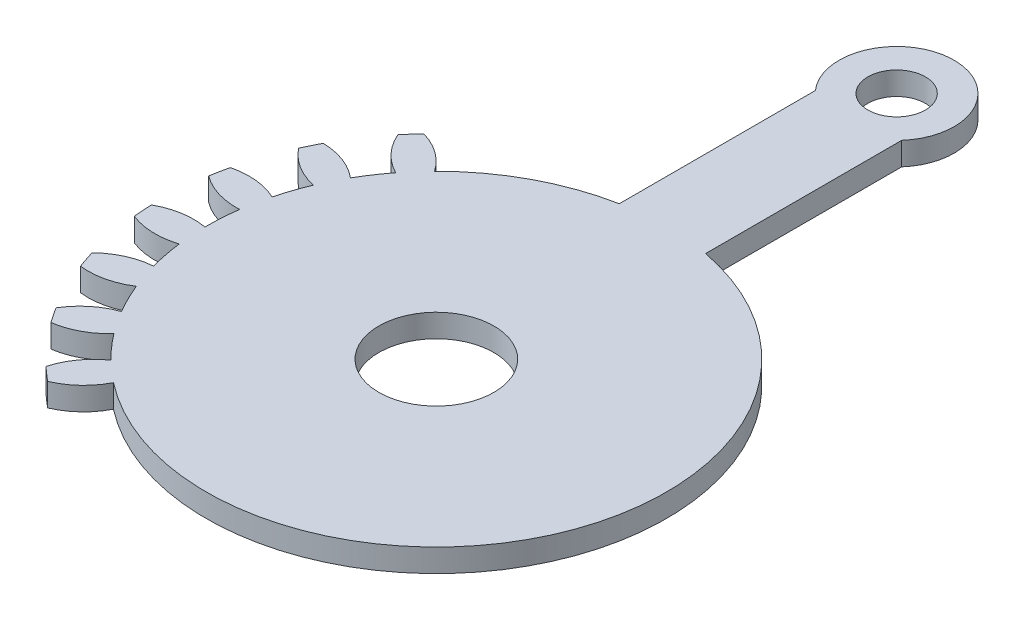
ISO-10303-21;
HEADER;
FILE_DESCRIPTION(('STEP AP214'),'2;1');
FILE_NAME('part.step','',(''),(''),'','','');
FILE_SCHEMA(('AUTOMOTIVE_DESIGN { 1 0 10303 214 1 1 1 1 }'));
ENDSEC;
DATA;
#1=APPLICATION_CONTEXT('core data for automotive mechanical design processes');
#2=APPLICATION_PROTOCOL_DEFINITION('international standard','automotive_design',2000,#1);
#3=PRODUCT_CONTEXT('',#1,'mechanical');
#4=PRODUCT('Part','Part','',(#3));
#5=PRODUCT_RELATED_PRODUCT_CATEGORY('part','',(#4));
#6=PRODUCT_DEFINITION_FORMATION('','',#4);
#7=PRODUCT_DEFINITION_CONTEXT('part definition',#1,'design');
#8=PRODUCT_DEFINITION('design','',#6,#7);
#9=PRODUCT_DEFINITION_SHAPE('','',#8);
#10=(LENGTH_UNIT() NAMED_UNIT(*) SI_UNIT(.MILLI.,.METRE.));
#11=(NAMED_UNIT(*) PLANE_ANGLE_UNIT() SI_UNIT($,.RADIAN.));
#12=(NAMED_UNIT(*) SI_UNIT($,.STERADIAN.) SOLID_ANGLE_UNIT());
#13=UNCERTAINTY_MEASURE_WITH_UNIT(LENGTH_MEASURE(1.E-05),#10,'distance_accuracy_value','');
#14=(GEOMETRIC_REPRESENTATION_CONTEXT(3) GLOBAL_UNCERTAINTY_ASSIGNED_CONTEXT((#13)) GLOBAL_UNIT_ASSIGNED_CONTEXT((#10,
#11,#12)) REPRESENTATION_CONTEXT('',''));
#15=CARTESIAN_POINT('',(0.,0.,0.));
#16=DIRECTION('',(0.,0.,1.));
#17=DIRECTION('',(1.,0.,0.));
#18=AXIS2_PLACEMENT_3D('',#15,#16,#17);
#19=CARTESIAN_POINT('',(0.,2.54,0.));
#20=DIRECTION('',(0.,-1.,0.));
#21=DIRECTION('',(0.,0.,-1.));
#22=AXIS2_PLACEMENT_3D('',#19,#20,#21);
#23=CYLINDRICAL_SURFACE('',#22,25.4);
#24=CARTESIAN_POINT('',(0.,2.54,0.));
#25=DIRECTION('',(0.,1.,0.));
#26=DIRECTION('',(0.,0.,1.));
#27=AXIS2_PLACEMENT_3D('',#24,#25,#26);
#28=CIRCLE('',#27,25.4);
#29=CARTESIAN_POINT('',(-4.7625,2.54,-24.949520912234));
#30=VERTEX_POINT('',#29);
#31=CARTESIAN_POINT('',(-18.0579662529017,2.54,-17.8625265516685));
#32=VERTEX_POINT('',#31);
#33=EDGE_CURVE('E56',#30,#32,#28,.T.);
#34=ORIENTED_EDGE('',*,*,#33,.F.);
#35=DIRECTION('',(0.,-1.,0.));
#36=VECTOR('',#35,1.);
#37=CARTESIAN_POINT('',(-4.7625,2.54,-24.949520912234));
#38=LINE('',#37,#36);
#39=CARTESIAN_POINT('',(-4.7625,0.,-24.949520912234));
#40=VERTEX_POINT('',#39);
#41=EDGE_CURVE('E274',#30,#40,#38,.T.);
#42=ORIENTED_EDGE('',*,*,#41,.T.);
#43=CARTESIAN_POINT('',(0.,0.,0.));
#44=DIRECTION('',(0.,1.,0.));
#45=DIRECTION('',(0.,0.,1.));
#46=AXIS2_PLACEMENT_3D('',#43,#44,#45);
#47=CIRCLE('',#46,25.4);
#48=CARTESIAN_POINT('',(-18.0579662529017,0.,-17.8625265516685));
#49=VERTEX_POINT('',#48);
#50=EDGE_CURVE('E630',#40,#49,#47,.T.);
#51=ORIENTED_EDGE('',*,*,#50,.T.);
#52=DIRECTION('',(0.,-1.,0.));
#53=VECTOR('',#52,1.);
#54=CARTESIAN_POINT('',(-18.0579662529017,2.54,-17.8625265516685));
#55=LINE('',#54,#53);
#56=EDGE_CURVE('E331',#32,#49,#55,.T.);
#57=ORIENTED_EDGE('',*,*,#56,.F.);
#58=EDGE_LOOP('',(#34,#42,#51,#57));
#59=FACE_BOUND('',#58,.T.);
#60=ADVANCED_FACE('F45',(#59),#23,.T.);
#61=DIRECTION('',(0.,-1.,0.));
#62=VECTOR('',#61,1.);
#63=CARTESIAN_POINT('',(-20.0667477350344,2.54,-15.5719502740823));
#64=LINE('',#63,#62);
#65=CARTESIAN_POINT('',(-20.0667477350344,2.54,-15.5719502740823));
#66=VERTEX_POINT('',#65);
#67=CARTESIAN_POINT('',(-20.0667477350344,0.,-15.5719502740823));
#68=VERTEX_POINT('',#67);
#69=EDGE_CURVE('E335',#66,#68,#64,.T.);
#70=ORIENTED_EDGE('',*,*,#69,.T.);
#71=CARTESIAN_POINT('',(-22.0658180391555,0.,-12.5801301369613));
#72=VERTEX_POINT('',#71);
#73=EDGE_CURVE('E619',#68,#72,#47,.T.);
#74=ORIENTED_EDGE('',*,*,#73,.T.);
#75=DIRECTION('',(0.,-1.,0.));
#76=VECTOR('',#75,1.);
#77=CARTESIAN_POINT('',(-22.0658180391555,2.54,-12.5801301369613));
#78=LINE('',#77,#76);
#79=CARTESIAN_POINT('',(-22.0658180391555,2.54,-12.5801301369613));
#80=VERTEX_POINT('',#79);
#81=EDGE_CURVE('E370',#80,#72,#78,.T.);
#82=ORIENTED_EDGE('',*,*,#81,.F.);
#83=EDGE_CURVE('E620',#66,#80,#28,.T.);
#84=ORIENTED_EDGE('',*,*,#83,.F.);
#85=EDGE_LOOP('',(#70,#74,#82,#84));
#86=FACE_BOUND('',#85,.T.);
#87=ADVANCED_FACE('F606',(#86),#23,.T.);
#88=DIRECTION('',(0.,-1.,0.));
#89=VECTOR('',#88,1.);
#90=CARTESIAN_POINT('',(-23.4133071872193,2.54,-9.84769244833043));
#91=LINE('',#90,#89);
#92=CARTESIAN_POINT('',(-23.4133071872193,2.54,-9.84769244833043));
#93=VERTEX_POINT('',#92);
#94=CARTESIAN_POINT('',(-23.4133071872193,0.,-9.84769244833043));
#95=VERTEX_POINT('',#94);
#96=EDGE_CURVE('E374',#93,#95,#91,.T.);
#97=ORIENTED_EDGE('',*,*,#96,.T.);
#98=CARTESIAN_POINT('',(-24.5699207915292,0.,-6.4404186430681));
#99=VERTEX_POINT('',#98);
#100=EDGE_CURVE('E582',#95,#99,#47,.T.);
#101=ORIENTED_EDGE('',*,*,#100,.T.);
#102=DIRECTION('',(0.,-1.,0.));
#103=VECTOR('',#102,1.);
#104=CARTESIAN_POINT('',(-24.5699207915292,2.54,-6.4404186430681));
#105=LINE('',#104,#103);
#106=CARTESIAN_POINT('',(-24.5699207915292,2.54,-6.4404186430681));
#107=VERTEX_POINT('',#106);
#108=EDGE_CURVE('E565',#107,#99,#105,.T.);
#109=ORIENTED_EDGE('',*,*,#108,.F.);
#110=EDGE_CURVE('E646',#93,#107,#28,.T.);
#111=ORIENTED_EDGE('',*,*,#110,.F.);
#112=EDGE_LOOP('',(#97,#101,#109,#111));
#113=FACE_BOUND('',#112,.T.);
#114=ADVANCED_FACE('F610',(#113),#23,.T.);
#115=CARTESIAN_POINT('',(-15.5719502740822,0.,20.0667477350345));
#116=VERTEX_POINT('',#115);
#117=CARTESIAN_POINT('',(4.7625,0.,-24.949520912234));
#118=VERTEX_POINT('',#117);
#119=EDGE_CURVE('E633',#116,#118,#47,.T.);
#120=ORIENTED_EDGE('',*,*,#119,.T.);
#121=DIRECTION('',(0.,-1.,0.));
#122=VECTOR('',#121,1.);
#123=CARTESIAN_POINT('',(4.7625,2.54,-24.949520912234));
#124=LINE('',#123,#122);
#125=CARTESIAN_POINT('',(4.7625,2.54,-24.949520912234));
#126=VERTEX_POINT('',#125);
#127=EDGE_CURVE('E70',#118,#126,#124,.F.);
#128=ORIENTED_EDGE('',*,*,#127,.T.);
#129=CARTESIAN_POINT('',(-15.5719502740822,2.54,20.0667477350345));
#130=VERTEX_POINT('',#129);
#131=EDGE_CURVE('E648',#130,#126,#28,.T.);
#132=ORIENTED_EDGE('',*,*,#131,.F.);
#133=DIRECTION('',(0.,-1.,0.));
#134=VECTOR('',#133,1.);
#135=CARTESIAN_POINT('',(-15.5719502740822,2.54,20.0667477350345));
#136=LINE('',#135,#134);
#137=EDGE_CURVE('E413',#130,#116,#136,.T.);
#138=ORIENTED_EDGE('',*,*,#137,.T.);
#139=EDGE_LOOP('',(#120,#128,#132,#138));
#140=FACE_BOUND('',#139,.T.);
#141=ADVANCED_FACE('F615',(#140),#23,.T.);
#142=CARTESIAN_POINT('',(-20.23500542252,0.,15.3526725865755));
#143=VERTEX_POINT('',#142);
#144=CARTESIAN_POINT('',(-17.8625265516685,0.,18.0579662529018));
#145=VERTEX_POINT('',#144);
#146=EDGE_CURVE('E636',#143,#145,#47,.T.);
#147=ORIENTED_EDGE('',*,*,#146,.T.);
#148=DIRECTION('',(0.,-1.,0.));
#149=VECTOR('',#148,1.);
#150=CARTESIAN_POINT('',(-17.8625265516685,2.54,18.0579662529018));
#151=LINE('',#150,#149);
#152=CARTESIAN_POINT('',(-17.8625265516685,2.54,18.0579662529018));
#153=VERTEX_POINT('',#152);
#154=EDGE_CURVE('E409',#153,#145,#151,.T.);
#155=ORIENTED_EDGE('',*,*,#154,.F.);
#156=CARTESIAN_POINT('',(-20.2350054225199,2.54,15.3526725865755));
#157=VERTEX_POINT('',#156);
#158=EDGE_CURVE('E652',#157,#153,#28,.T.);
#159=ORIENTED_EDGE('',*,*,#158,.F.);
#160=DIRECTION('',(0.,-1.,0.));
#161=VECTOR('',#160,1.);
#162=CARTESIAN_POINT('',(-20.23500542252,2.54,15.3526725865755));
#163=LINE('',#162,#161);
#164=EDGE_CURVE('E452',#157,#143,#163,.T.);
#165=ORIENTED_EDGE('',*,*,#164,.T.);
#166=EDGE_LOOP('',(#147,#155,#159,#165));
#167=FACE_BOUND('',#166,.T.);
#168=ADVANCED_FACE('F714',(#167),#23,.T.);
#169=CARTESIAN_POINT('',(-23.5190783913405,0.,9.59233817283255));
#170=VERTEX_POINT('',#169);
#171=CARTESIAN_POINT('',(-21.9276213011004,0.,12.819493908713));
#172=VERTEX_POINT('',#171);
#173=EDGE_CURVE('E638',#170,#172,#47,.T.);
#174=ORIENTED_EDGE('',*,*,#173,.T.);
#175=DIRECTION('',(0.,-1.,0.));
#176=VECTOR('',#175,1.);
#177=CARTESIAN_POINT('',(-21.9276213011004,2.54,12.819493908713));
#178=LINE('',#177,#176);
#179=CARTESIAN_POINT('',(-21.9276213011004,2.54,12.819493908713));
#180=VERTEX_POINT('',#179);
#181=EDGE_CURVE('E448',#180,#172,#178,.T.);
#182=ORIENTED_EDGE('',*,*,#181,.F.);
#183=CARTESIAN_POINT('',(-23.5190783913405,2.54,9.59233817283255));
#184=VERTEX_POINT('',#183);
#185=EDGE_CURVE('E656',#184,#180,#28,.T.);
#186=ORIENTED_EDGE('',*,*,#185,.F.);
#187=DIRECTION('',(0.,-1.,0.));
#188=VECTOR('',#187,1.);
#189=CARTESIAN_POINT('',(-23.5190783913405,2.54,9.59233817283255));
#190=LINE('',#189,#188);
#191=EDGE_CURVE('E491',#184,#170,#190,.T.);
#192=ORIENTED_EDGE('',*,*,#191,.T.);
#193=EDGE_LOOP('',(#174,#182,#186,#192));
#194=FACE_BOUND('',#193,.T.);
#195=ADVANCED_FACE('F730',(#194),#23,.T.);
#196=CARTESIAN_POINT('',(-25.2003650349059,0.,3.17830176469937));
#197=VERTEX_POINT('',#196);
#198=CARTESIAN_POINT('',(-24.4983848959698,0.,6.70739423986077));
#199=VERTEX_POINT('',#198);
#200=EDGE_CURVE('E641',#197,#199,#47,.T.);
#201=ORIENTED_EDGE('',*,*,#200,.T.);
#202=DIRECTION('',(0.,-1.,0.));
#203=VECTOR('',#202,1.);
#204=CARTESIAN_POINT('',(-24.4983848959698,2.54,6.70739423986077));
#205=LINE('',#204,#203);
#206=CARTESIAN_POINT('',(-24.4983848959698,2.54,6.70739423986077));
#207=VERTEX_POINT('',#206);
#208=EDGE_CURVE('E487',#207,#199,#205,.T.);
#209=ORIENTED_EDGE('',*,*,#208,.F.);
#210=CARTESIAN_POINT('',(-25.2003650349059,2.54,3.17830176469936));
#211=VERTEX_POINT('',#210);
#212=EDGE_CURVE('E55',#211,#207,#28,.T.);
#213=ORIENTED_EDGE('',*,*,#212,.F.);
#214=DIRECTION('',(0.,-1.,0.));
#215=VECTOR('',#214,1.);
#216=CARTESIAN_POINT('',(-25.2003650349059,2.54,3.17830176469937));
#217=LINE('',#216,#215);
#218=EDGE_CURVE('E530',#211,#197,#217,.T.);
#219=ORIENTED_EDGE('',*,*,#218,.T.);
#220=EDGE_LOOP('',(#201,#209,#213,#219));
#221=FACE_BOUND('',#220,.T.);
#222=ADVANCED_FACE('F603',(#221),#23,.T.);
#223=CARTESIAN_POINT('',(-25.1642884469148,0.,-3.45233065630608));
#224=VERTEX_POINT('',#223);
#225=CARTESIAN_POINT('',(-25.3996240456742,0.,0.138196738055112));
#226=VERTEX_POINT('',#225);
#227=EDGE_CURVE('E49',#224,#226,#47,.T.);
#228=ORIENTED_EDGE('',*,*,#227,.T.);
#229=DIRECTION('',(0.,-1.,0.));
#230=VECTOR('',#229,1.);
#231=CARTESIAN_POINT('',(-25.3996240456742,2.54,0.138196738055112));
#232=LINE('',#231,#230);
#233=CARTESIAN_POINT('',(-25.3996240456742,2.54,0.138196738055112));
#234=VERTEX_POINT('',#233);
#235=EDGE_CURVE('E526',#234,#226,#232,.T.);
#236=ORIENTED_EDGE('',*,*,#235,.F.);
#237=CARTESIAN_POINT('',(-25.1642884469148,2.54,-3.45233065630609));
#238=VERTEX_POINT('',#237);
#239=EDGE_CURVE('E11',#238,#234,#28,.T.);
#240=ORIENTED_EDGE('',*,*,#239,.F.);
#241=DIRECTION('',(0.,-1.,0.));
#242=VECTOR('',#241,1.);
#243=CARTESIAN_POINT('',(-25.1642884469148,2.54,-3.45233065630608));
#244=LINE('',#243,#242);
#245=EDGE_CURVE('E569',#238,#224,#244,.T.);
#246=ORIENTED_EDGE('',*,*,#245,.T.);
#247=EDGE_LOOP('',(#228,#236,#240,#246));
#248=FACE_BOUND('',#247,.T.);
#249=ADVANCED_FACE('F47',(#248),#23,.T.);
#250=CARTESIAN_POINT('',(0.,2.54,0.));
#251=DIRECTION('',(0.,1.,0.));
#252=DIRECTION('',(0.,0.,1.));
#253=AXIS2_PLACEMENT_3D('',#250,#251,#252);
#254=PLANE('',#253);
#255=CARTESIAN_POINT('',(0.,2.54,0.));
#256=DIRECTION('',(0.,1.,0.));
#257=DIRECTION('',(0.,0.,1.));
#258=AXIS2_PLACEMENT_3D('',#255,#256,#257);
#259=CIRCLE('',#258,6.35);
#260=CARTESIAN_POINT('',(0.,2.54,6.35));
#261=VERTEX_POINT('',#260);
#262=EDGE_CURVE('E578',#261,#261,#259,.T.);
#263=ORIENTED_EDGE('',*,*,#262,.F.);
#264=EDGE_LOOP('',(#263));
#265=FACE_BOUND('',#264,.T.);
#266=ORIENTED_EDGE('',*,*,#131,.T.);
#267=DIRECTION('',(0.,0.,-1.));
#268=VECTOR('',#267,1.);
#269=CARTESIAN_POINT('',(4.7625,2.54,-46.599869793685));
#270=LINE('',#269,#268);
#271=CARTESIAN_POINT('',(4.7625,2.54,-46.599869793685));
#272=VERTEX_POINT('',#271);
#273=EDGE_CURVE('E269',#126,#272,#270,.T.);
#274=ORIENTED_EDGE('',*,*,#273,.T.);
#275=CARTESIAN_POINT('',(0.,2.54,-50.8));
#276=DIRECTION('',(0.,1.,0.));
#277=DIRECTION('',(0.,0.,1.));
#278=AXIS2_PLACEMENT_3D('',#275,#276,#277);
#279=CIRCLE('',#278,6.35);
#280=CARTESIAN_POINT('',(-4.7625,2.54,-46.599869793685));
#281=VERTEX_POINT('',#280);
#282=EDGE_CURVE('E263',#272,#281,#279,.T.);
#283=ORIENTED_EDGE('',*,*,#282,.T.);
#284=DIRECTION('',(0.,0.,1.));
#285=VECTOR('',#284,1.);
#286=CARTESIAN_POINT('',(-4.7625,2.54,-46.599869793685));
#287=LINE('',#286,#285);
#288=EDGE_CURVE('E272',#281,#30,#287,.T.);
#289=ORIENTED_EDGE('',*,*,#288,.T.);
#290=ORIENTED_EDGE('',*,*,#33,.T.);
#291=CARTESIAN_POINT('',(-24.3199642046817,2.54,-13.5206627062787));
#292=DIRECTION('',(0.,1.,0.));
#293=DIRECTION('',(-0.500000000000001,0.,0.866025403784438));
#294=AXIS2_PLACEMENT_3D('',#291,#292,#293);
#295=CIRCLE('',#294,7.62);
#296=CARTESIAN_POINT('',(-22.2335438772269,2.54,-20.8494586658605));
#297=VERTEX_POINT('',#296);
#298=EDGE_CURVE('E314',#297,#32,#295,.F.);
#299=ORIENTED_EDGE('',*,*,#298,.F.);
#300=CARTESIAN_POINT('',(0.,2.54,0.));
#301=DIRECTION('',(0.,1.,0.));
#302=DIRECTION('',(-0.500000000000001,0.,0.866025403784438));
#303=AXIS2_PLACEMENT_3D('',#300,#301,#302);
#304=CIRCLE('',#303,30.48);
#305=CARTESIAN_POINT('',(-23.5731484785449,2.54,-19.3219323777017));
#306=VERTEX_POINT('',#305);
#307=EDGE_CURVE('E305',#297,#306,#304,.T.);
#308=ORIENTED_EDGE('',*,*,#307,.T.);
#309=CARTESIAN_POINT('',(-16.5793838850735,2.54,-22.3471029201845));
#310=DIRECTION('',(0.,1.,0.));
#311=DIRECTION('',(-0.500000000000001,0.,0.866025403784438));
#312=AXIS2_PLACEMENT_3D('',#309,#310,#311);
#313=CIRCLE('',#312,7.62);
#314=EDGE_CURVE('E309',#306,#66,#313,.T.);
#315=ORIENTED_EDGE('',*,*,#314,.T.);
#316=ORIENTED_EDGE('',*,*,#83,.T.);
#317=CARTESIAN_POINT('',(-26.9906865305201,2.54,-6.76548738415482));
#318=DIRECTION('',(0.,1.,0.));
#319=DIRECTION('',(-0.258819045102521,0.,0.965925826289068));
#320=AXIS2_PLACEMENT_3D('',#317,#318,#319);
#321=CIRCLE('',#320,7.62);
#322=CARTESIAN_POINT('',(-26.8721912237471,2.54,-14.3845659939523));
#323=VERTEX_POINT('',#322);
#324=EDGE_CURVE('E353',#323,#80,#321,.F.);
#325=ORIENTED_EDGE('',*,*,#324,.F.);
#326=CARTESIAN_POINT('',(0.,2.54,0.));
#327=DIRECTION('',(0.,1.,0.));
#328=DIRECTION('',(-0.258819045102521,0.,0.965925826289068));
#329=AXIS2_PLACEMENT_3D('',#326,#327,#328);
#330=CIRCLE('',#329,30.48);
#331=CARTESIAN_POINT('',(-27.7707970099056,2.54,-12.562373718156));
#332=VERTEX_POINT('',#331);
#333=EDGE_CURVE('E344',#323,#332,#330,.T.);
#334=ORIENTED_EDGE('',*,*,#333,.T.);
#335=CARTESIAN_POINT('',(-21.7983109171632,2.54,-17.2945835478232));
#336=DIRECTION('',(0.,1.,0.));
#337=DIRECTION('',(-0.258819045102521,0.,0.965925826289068));
#338=AXIS2_PLACEMENT_3D('',#335,#336,#337);
#339=CIRCLE('',#338,7.62);
#340=EDGE_CURVE('E348',#332,#93,#339,.T.);
#341=ORIENTED_EDGE('',*,*,#340,.T.);
#342=ORIENTED_EDGE('',*,*,#110,.T.);
#343=CARTESIAN_POINT('',(-27.8220381735219,2.54,0.450744722702677));
#344=DIRECTION('',(0.,1.,0.));
#345=DIRECTION('',(0.,0.,1.));
#346=AXIS2_PLACEMENT_3D('',#343,#344,#345);
#347=CIRCLE('',#346,7.62);
#348=CARTESIAN_POINT('',(-29.6795431467647,2.54,-6.93938892117538));
#349=VERTEX_POINT('',#348);
#350=EDGE_CURVE('E548',#349,#107,#347,.F.);
#351=ORIENTED_EDGE('',*,*,#350,.F.);
#352=CARTESIAN_POINT('',(0.,2.54,0.));
#353=DIRECTION('',(0.,1.,0.));
#354=DIRECTION('',(0.,0.,1.));
#355=AXIS2_PLACEMENT_3D('',#352,#353,#354);
#356=CIRCLE('',#355,30.48);
#357=CARTESIAN_POINT('',(-30.0759116184532,2.54,-4.94671005002223));
#358=VERTEX_POINT('',#357);
#359=EDGE_CURVE('E539',#349,#358,#356,.T.);
#360=ORIENTED_EDGE('',*,*,#359,.T.);
#361=CARTESIAN_POINT('',(-25.5317190836603,2.54,-11.0634668873284));
#362=DIRECTION('',(0.,1.,0.));
#363=DIRECTION('',(0.,0.,1.));
#364=AXIS2_PLACEMENT_3D('',#361,#362,#363);
#365=CIRCLE('',#364,7.62);
#366=EDGE_CURVE('E543',#358,#238,#365,.T.);
#367=ORIENTED_EDGE('',*,*,#366,.T.);
#368=ORIENTED_EDGE('',*,*,#239,.T.);
#369=CARTESIAN_POINT('',(-26.7573638930902,2.54,7.63625932159886));
#370=DIRECTION('',(0.,1.,0.));
#371=DIRECTION('',(0.258819045102521,0.,0.965925826289068));
#372=AXIS2_PLACEMENT_3D('',#369,#370,#371);
#373=CIRCLE('',#372,7.62);
#374=CARTESIAN_POINT('',(-30.4642832520944,2.54,0.978696038697195));
#375=VERTEX_POINT('',#374);
#376=EDGE_CURVE('E509',#375,#234,#373,.F.);
#377=ORIENTED_EDGE('',*,*,#376,.F.);
#378=CARTESIAN_POINT('',(0.,2.54,0.));
#379=DIRECTION('',(0.,1.,0.));
#380=DIRECTION('',(0.258819045102521,0.,0.965925826289068));
#381=AXIS2_PLACEMENT_3D('',#378,#379,#380);
#382=CIRCLE('',#381,30.48);
#383=CARTESIAN_POINT('',(-30.3314025529972,2.54,3.00606373319573));
#384=VERTEX_POINT('',#383);
#385=EDGE_CURVE('E500',#375,#384,#382,.T.);
#386=ORIENTED_EDGE('',*,*,#385,.T.);
#387=CARTESIAN_POINT('',(-27.5251827877666,2.54,-4.07839324170567));
#388=DIRECTION('',(0.,1.,0.));
#389=DIRECTION('',(0.258819045102521,0.,0.965925826289068));
#390=AXIS2_PLACEMENT_3D('',#387,#388,#389);
#391=CIRCLE('',#390,7.62);
#392=EDGE_CURVE('E504',#384,#211,#391,.T.);
#393=ORIENTED_EDGE('',*,*,#392,.T.);
#394=ORIENTED_EDGE('',*,*,#212,.T.);
#395=CARTESIAN_POINT('',(-23.869219481979,2.54,14.3013754672433));
#396=DIRECTION('',(0.,1.,0.));
#397=DIRECTION('',(0.500000000000001,0.,0.866025403784438));
#398=AXIS2_PLACEMENT_3D('',#395,#396,#397);
#399=CIRCLE('',#398,7.62);
#400=CARTESIAN_POINT('',(-29.1729327984023,2.54,8.83008448090422));
#401=VERTEX_POINT('',#400);
#402=EDGE_CURVE('E470',#401,#207,#399,.F.);
#403=ORIENTED_EDGE('',*,*,#402,.F.);
#404=CARTESIAN_POINT('',(0.,2.54,0.));
#405=DIRECTION('',(0.,1.,0.));
#406=DIRECTION('',(0.500000000000001,0.,0.866025403784438));
#407=AXIS2_PLACEMENT_3D('',#404,#405,#406);
#408=CIRCLE('',#407,30.48);
#409=CARTESIAN_POINT('',(-28.5198585285671,2.54,10.7539792407516));
#410=VERTEX_POINT('',#409);
#411=EDGE_CURVE('E461',#401,#410,#408,.T.);
#412=ORIENTED_EDGE('',*,*,#411,.T.);
#413=CARTESIAN_POINT('',(-27.6428507724019,2.54,3.18461616347581));
#414=DIRECTION('',(0.,1.,0.));
#415=DIRECTION('',(0.500000000000001,0.,0.866025403784438));
#416=AXIS2_PLACEMENT_3D('',#413,#414,#415);
#417=CIRCLE('',#416,7.62);
#418=EDGE_CURVE('E465',#410,#184,#417,.T.);
#419=ORIENTED_EDGE('',*,*,#418,.T.);
#420=ORIENTED_EDGE('',*,*,#185,.T.);
#421=CARTESIAN_POINT('',(-19.3544272089212,2.54,19.9918765089355));
#422=DIRECTION('',(0.,1.,0.));
#423=DIRECTION('',(0.707106781186549,0.,0.707106781186546));
#424=AXIS2_PLACEMENT_3D('',#421,#422,#423);
#425=CIRCLE('',#424,7.62);
#426=CARTESIAN_POINT('',(-25.8934951850499,2.54,16.0797172581422));
#427=VERTEX_POINT('',#426);
#428=EDGE_CURVE('E431',#427,#180,#425,.F.);
#429=ORIENTED_EDGE('',*,*,#428,.F.);
#430=CARTESIAN_POINT('',(0.,2.54,0.));
#431=DIRECTION('',(0.,1.,0.));
#432=DIRECTION('',(0.707106781186549,0.,0.707106781186546));
#433=AXIS2_PLACEMENT_3D('',#430,#431,#432);
#434=CIRCLE('',#433,30.48);
#435=CARTESIAN_POINT('',(-24.7647332767099,2.54,17.7690288348412));
#436=VERTEX_POINT('',#435);
#437=EDGE_CURVE('E422',#427,#436,#434,.T.);
#438=ORIENTED_EDGE('',*,*,#437,.T.);
#439=CARTESIAN_POINT('',(-25.8767041588689,2.54,10.2305992399435));
#440=DIRECTION('',(0.,1.,0.));
#441=DIRECTION('',(0.707106781186549,0.,0.707106781186546));
#442=AXIS2_PLACEMENT_3D('',#439,#440,#441);
#443=CIRCLE('',#442,7.62);
#444=EDGE_CURVE('E426',#436,#157,#443,.T.);
#445=ORIENTED_EDGE('',*,*,#444,.T.);
#446=ORIENTED_EDGE('',*,*,#158,.T.);
#447=CARTESIAN_POINT('',(-13.5206627062786,2.54,24.3199642046817));
#448=DIRECTION('',(0.,1.,0.));
#449=DIRECTION('',(0.86602540378444,0.,0.499999999999998));
#450=AXIS2_PLACEMENT_3D('',#447,#448,#449);
#451=CIRCLE('',#450,7.62);
#452=CARTESIAN_POINT('',(-20.8494586658605,2.54,22.2335438772269));
#453=VERTEX_POINT('',#452);
#454=EDGE_CURVE('E392',#453,#153,#451,.F.);
#455=ORIENTED_EDGE('',*,*,#454,.F.);
#456=CARTESIAN_POINT('',(0.,2.54,0.));
#457=DIRECTION('',(0.,1.,0.));
#458=DIRECTION('',(0.86602540378444,0.,0.499999999999998));
#459=AXIS2_PLACEMENT_3D('',#456,#457,#458);
#460=CIRCLE('',#459,30.48);
#461=CARTESIAN_POINT('',(-19.3219323777016,2.54,23.573148478545));
#462=VERTEX_POINT('',#461);
#463=EDGE_CURVE('E383',#453,#462,#460,.T.);
#464=ORIENTED_EDGE('',*,*,#463,.T.);
#465=CARTESIAN_POINT('',(-22.3471029201845,2.54,16.5793838850736));
#466=DIRECTION('',(0.,1.,0.));
#467=DIRECTION('',(0.86602540378444,0.,0.499999999999998));
#468=AXIS2_PLACEMENT_3D('',#465,#466,#467);
#469=CIRCLE('',#468,7.62);
#470=EDGE_CURVE('E387',#462,#130,#469,.T.);
#471=ORIENTED_EDGE('',*,*,#470,.T.);
#472=EDGE_LOOP('',(#266,#274,#283,#289,#290,#299,#308,#315,#316,#325,#334,#341,#342,#351,#360,
#367,#368,#377,#386,#393,#394,#403,#412,#419,#420,#429,#438,#445,#446,#455,#464,#471));
#473=FACE_BOUND('',#472,.T.);
#474=CARTESIAN_POINT('',(0.,2.54,-50.8));
#475=DIRECTION('',(0.,1.,0.));
#476=DIRECTION('',(0.,0.,1.));
#477=AXIS2_PLACEMENT_3D('',#474,#475,#476);
#478=CIRCLE('',#477,3.175);
#479=CARTESIAN_POINT('',(0.,2.54,-47.625));
#480=VERTEX_POINT('',#479);
#481=EDGE_CURVE('E283',#480,#480,#478,.T.);
#482=ORIENTED_EDGE('',*,*,#481,.F.);
#483=EDGE_LOOP('',(#482));
#484=FACE_BOUND('',#483,.T.);
#485=ADVANCED_FACE('F278',(#265,#473,#484),#254,.T.);
#486=CARTESIAN_POINT('',(0.,0.,0.));
#487=DIRECTION('',(0.,1.,0.));
#488=DIRECTION('',(0.,0.,1.));
#489=AXIS2_PLACEMENT_3D('',#486,#487,#488);
#490=PLANE('',#489);
#491=CARTESIAN_POINT('',(0.,0.,0.));
#492=DIRECTION('',(0.,1.,0.));
#493=DIRECTION('',(0.,0.,1.));
#494=AXIS2_PLACEMENT_3D('',#491,#492,#493);
#495=CIRCLE('',#494,6.35);
#496=CARTESIAN_POINT('',(0.,0.,6.35));
#497=VERTEX_POINT('',#496);
#498=EDGE_CURVE('E577',#497,#497,#495,.T.);
#499=ORIENTED_EDGE('',*,*,#498,.T.);
#500=EDGE_LOOP('',(#499));
#501=FACE_BOUND('',#500,.T.);
#502=ORIENTED_EDGE('',*,*,#50,.F.);
#503=DIRECTION('',(0.,0.,-1.));
#504=VECTOR('',#503,1.);
#505=CARTESIAN_POINT('',(-4.7625,0.,-46.599869793685));
#506=LINE('',#505,#504);
#507=CARTESIAN_POINT('',(-4.7625,0.,-46.599869793685));
#508=VERTEX_POINT('',#507);
#509=EDGE_CURVE('E299',#40,#508,#506,.T.);
#510=ORIENTED_EDGE('',*,*,#509,.T.);
#511=CARTESIAN_POINT('',(0.,0.,-50.8));
#512=DIRECTION('',(0.,1.,0.));
#513=DIRECTION('',(0.,0.,1.));
#514=AXIS2_PLACEMENT_3D('',#511,#512,#513);
#515=CIRCLE('',#514,6.35);
#516=CARTESIAN_POINT('',(4.7625,0.,-46.599869793685));
#517=VERTEX_POINT('',#516);
#518=EDGE_CURVE('E264',#508,#517,#515,.F.);
#519=ORIENTED_EDGE('',*,*,#518,.T.);
#520=DIRECTION('',(0.,0.,1.));
#521=VECTOR('',#520,1.);
#522=CARTESIAN_POINT('',(4.7625,0.,-46.599869793685));
#523=LINE('',#522,#521);
#524=EDGE_CURVE('E293',#517,#118,#523,.T.);
#525=ORIENTED_EDGE('',*,*,#524,.T.);
#526=ORIENTED_EDGE('',*,*,#119,.F.);
#527=CARTESIAN_POINT('',(-22.3471029201845,0.,16.5793838850736));
#528=DIRECTION('',(0.,1.,0.));
#529=DIRECTION('',(0.86602540378444,0.,0.499999999999998));
#530=AXIS2_PLACEMENT_3D('',#527,#528,#529);
#531=CIRCLE('',#530,7.62);
#532=CARTESIAN_POINT('',(-19.3219323777016,0.,23.573148478545));
#533=VERTEX_POINT('',#532);
#534=EDGE_CURVE('E400',#533,#116,#531,.T.);
#535=ORIENTED_EDGE('',*,*,#534,.F.);
#536=CARTESIAN_POINT('',(0.,0.,0.));
#537=DIRECTION('',(0.,1.,0.));
#538=DIRECTION('',(0.86602540378444,0.,0.499999999999998));
#539=AXIS2_PLACEMENT_3D('',#536,#537,#538);
#540=CIRCLE('',#539,30.48);
#541=CARTESIAN_POINT('',(-20.8494586658605,0.,22.2335438772269));
#542=VERTEX_POINT('',#541);
#543=EDGE_CURVE('E382',#542,#533,#540,.T.);
#544=ORIENTED_EDGE('',*,*,#543,.F.);
#545=CARTESIAN_POINT('',(-13.5206627062786,0.,24.3199642046817));
#546=DIRECTION('',(0.,1.,0.));
#547=DIRECTION('',(0.86602540378444,0.,0.499999999999998));
#548=AXIS2_PLACEMENT_3D('',#545,#546,#547);
#549=CIRCLE('',#548,7.62);
#550=EDGE_CURVE('E388',#542,#145,#549,.F.);
#551=ORIENTED_EDGE('',*,*,#550,.T.);
#552=ORIENTED_EDGE('',*,*,#146,.F.);
#553=CARTESIAN_POINT('',(-25.8767041588689,0.,10.2305992399435));
#554=DIRECTION('',(0.,1.,0.));
#555=DIRECTION('',(0.707106781186549,0.,0.707106781186546));
#556=AXIS2_PLACEMENT_3D('',#553,#554,#555);
#557=CIRCLE('',#556,7.62);
#558=CARTESIAN_POINT('',(-24.7647332767099,0.,17.7690288348412));
#559=VERTEX_POINT('',#558);
#560=EDGE_CURVE('E439',#559,#143,#557,.T.);
#561=ORIENTED_EDGE('',*,*,#560,.F.);
#562=CARTESIAN_POINT('',(0.,0.,0.));
#563=DIRECTION('',(0.,1.,0.));
#564=DIRECTION('',(0.707106781186549,0.,0.707106781186546));
#565=AXIS2_PLACEMENT_3D('',#562,#563,#564);
#566=CIRCLE('',#565,30.48);
#567=CARTESIAN_POINT('',(-25.8934951850499,0.,16.0797172581422));
#568=VERTEX_POINT('',#567);
#569=EDGE_CURVE('E421',#568,#559,#566,.T.);
#570=ORIENTED_EDGE('',*,*,#569,.F.);
#571=CARTESIAN_POINT('',(-19.3544272089212,0.,19.9918765089355));
#572=DIRECTION('',(0.,1.,0.));
#573=DIRECTION('',(0.707106781186549,0.,0.707106781186546));
#574=AXIS2_PLACEMENT_3D('',#571,#572,#573);
#575=CIRCLE('',#574,7.62);
#576=EDGE_CURVE('E427',#568,#172,#575,.F.);
#577=ORIENTED_EDGE('',*,*,#576,.T.);
#578=ORIENTED_EDGE('',*,*,#173,.F.);
#579=CARTESIAN_POINT('',(-27.6428507724019,0.,3.18461616347581));
#580=DIRECTION('',(0.,1.,0.));
#581=DIRECTION('',(0.500000000000001,0.,0.866025403784438));
#582=AXIS2_PLACEMENT_3D('',#579,#580,#581);
#583=CIRCLE('',#582,7.62);
#584=CARTESIAN_POINT('',(-28.5198585285671,0.,10.7539792407516));
#585=VERTEX_POINT('',#584);
#586=EDGE_CURVE('E478',#585,#170,#583,.T.);
#587=ORIENTED_EDGE('',*,*,#586,.F.);
#588=CARTESIAN_POINT('',(0.,0.,0.));
#589=DIRECTION('',(0.,1.,0.));
#590=DIRECTION('',(0.500000000000001,0.,0.866025403784438));
#591=AXIS2_PLACEMENT_3D('',#588,#589,#590);
#592=CIRCLE('',#591,30.48);
#593=CARTESIAN_POINT('',(-29.1729327984023,0.,8.83008448090422));
#594=VERTEX_POINT('',#593);
#595=EDGE_CURVE('E460',#594,#585,#592,.T.);
#596=ORIENTED_EDGE('',*,*,#595,.F.);
#597=CARTESIAN_POINT('',(-23.869219481979,0.,14.3013754672433));
#598=DIRECTION('',(0.,1.,0.));
#599=DIRECTION('',(0.500000000000001,0.,0.866025403784438));
#600=AXIS2_PLACEMENT_3D('',#597,#598,#599);
#601=CIRCLE('',#600,7.62);
#602=EDGE_CURVE('E466',#594,#199,#601,.F.);
#603=ORIENTED_EDGE('',*,*,#602,.T.);
#604=ORIENTED_EDGE('',*,*,#200,.F.);
#605=CARTESIAN_POINT('',(-27.5251827877666,0.,-4.07839324170567));
#606=DIRECTION('',(0.,1.,0.));
#607=DIRECTION('',(0.258819045102521,0.,0.965925826289068));
#608=AXIS2_PLACEMENT_3D('',#605,#606,#607);
#609=CIRCLE('',#608,7.62);
#610=CARTESIAN_POINT('',(-30.3314025529972,0.,3.00606373319573));
#611=VERTEX_POINT('',#610);
#612=EDGE_CURVE('E517',#611,#197,#609,.T.);
#613=ORIENTED_EDGE('',*,*,#612,.F.);
#614=CARTESIAN_POINT('',(0.,0.,0.));
#615=DIRECTION('',(0.,1.,0.));
#616=DIRECTION('',(0.258819045102521,0.,0.965925826289068));
#617=AXIS2_PLACEMENT_3D('',#614,#615,#616);
#618=CIRCLE('',#617,30.48);
#619=CARTESIAN_POINT('',(-30.4642832520944,0.,0.978696038697195));
#620=VERTEX_POINT('',#619);
#621=EDGE_CURVE('E499',#620,#611,#618,.T.);
#622=ORIENTED_EDGE('',*,*,#621,.F.);
#623=CARTESIAN_POINT('',(-26.7573638930902,0.,7.63625932159886));
#624=DIRECTION('',(0.,1.,0.));
#625=DIRECTION('',(0.258819045102521,0.,0.965925826289068));
#626=AXIS2_PLACEMENT_3D('',#623,#624,#625);
#627=CIRCLE('',#626,7.62);
#628=EDGE_CURVE('E505',#620,#226,#627,.F.);
#629=ORIENTED_EDGE('',*,*,#628,.T.);
#630=ORIENTED_EDGE('',*,*,#227,.F.);
#631=CARTESIAN_POINT('',(-25.5317190836603,0.,-11.0634668873284));
#632=DIRECTION('',(0.,1.,0.));
#633=DIRECTION('',(0.,0.,1.));
#634=AXIS2_PLACEMENT_3D('',#631,#632,#633);
#635=CIRCLE('',#634,7.62);
#636=CARTESIAN_POINT('',(-30.0759116184532,0.,-4.94671005002223));
#637=VERTEX_POINT('',#636);
#638=EDGE_CURVE('E556',#637,#224,#635,.T.);
#639=ORIENTED_EDGE('',*,*,#638,.F.);
#640=CARTESIAN_POINT('',(0.,0.,0.));
#641=DIRECTION('',(0.,1.,0.));
#642=DIRECTION('',(0.,0.,1.));
#643=AXIS2_PLACEMENT_3D('',#640,#641,#642);
#644=CIRCLE('',#643,30.48);
#645=CARTESIAN_POINT('',(-29.6795431467647,0.,-6.93938892117538));
#646=VERTEX_POINT('',#645);
#647=EDGE_CURVE('E538',#646,#637,#644,.T.);
#648=ORIENTED_EDGE('',*,*,#647,.F.);
#649=CARTESIAN_POINT('',(-27.8220381735219,0.,0.450744722702677));
#650=DIRECTION('',(0.,1.,0.));
#651=DIRECTION('',(0.,0.,1.));
#652=AXIS2_PLACEMENT_3D('',#649,#650,#651);
#653=CIRCLE('',#652,7.62);
#654=EDGE_CURVE('E544',#646,#99,#653,.F.);
#655=ORIENTED_EDGE('',*,*,#654,.T.);
#656=ORIENTED_EDGE('',*,*,#100,.F.);
#657=CARTESIAN_POINT('',(-21.7983109171632,0.,-17.2945835478232));
#658=DIRECTION('',(0.,1.,0.));
#659=DIRECTION('',(-0.258819045102521,0.,0.965925826289068));
#660=AXIS2_PLACEMENT_3D('',#657,#658,#659);
#661=CIRCLE('',#660,7.62);
#662=CARTESIAN_POINT('',(-27.7707970099056,0.,-12.562373718156));
#663=VERTEX_POINT('',#662);
#664=EDGE_CURVE('E361',#663,#95,#661,.T.);
#665=ORIENTED_EDGE('',*,*,#664,.F.);
#666=CARTESIAN_POINT('',(0.,0.,0.));
#667=DIRECTION('',(0.,1.,0.));
#668=DIRECTION('',(-0.258819045102521,0.,0.965925826289068));
#669=AXIS2_PLACEMENT_3D('',#666,#667,#668);
#670=CIRCLE('',#669,30.48);
#671=CARTESIAN_POINT('',(-26.8721912237471,0.,-14.3845659939523));
#672=VERTEX_POINT('',#671);
#673=EDGE_CURVE('E343',#672,#663,#670,.T.);
#674=ORIENTED_EDGE('',*,*,#673,.F.);
#675=CARTESIAN_POINT('',(-26.9906865305201,0.,-6.76548738415482));
#676=DIRECTION('',(0.,1.,0.));
#677=DIRECTION('',(-0.258819045102521,0.,0.965925826289068));
#678=AXIS2_PLACEMENT_3D('',#675,#676,#677);
#679=CIRCLE('',#678,7.62);
#680=EDGE_CURVE('E349',#672,#72,#679,.F.);
#681=ORIENTED_EDGE('',*,*,#680,.T.);
#682=ORIENTED_EDGE('',*,*,#73,.F.);
#683=CARTESIAN_POINT('',(-16.5793838850735,0.,-22.3471029201845));
#684=DIRECTION('',(0.,1.,0.));
#685=DIRECTION('',(-0.500000000000001,0.,0.866025403784438));
#686=AXIS2_PLACEMENT_3D('',#683,#684,#685);
#687=CIRCLE('',#686,7.62);
#688=CARTESIAN_POINT('',(-23.5731484785449,0.,-19.3219323777017));
#689=VERTEX_POINT('',#688);
#690=EDGE_CURVE('E322',#689,#68,#687,.T.);
#691=ORIENTED_EDGE('',*,*,#690,.F.);
#692=CARTESIAN_POINT('',(0.,0.,0.));
#693=DIRECTION('',(0.,1.,0.));
#694=DIRECTION('',(-0.500000000000001,0.,0.866025403784438));
#695=AXIS2_PLACEMENT_3D('',#692,#693,#694);
#696=CIRCLE('',#695,30.48);
#697=CARTESIAN_POINT('',(-22.2335438772269,0.,-20.8494586658605));
#698=VERTEX_POINT('',#697);
#699=EDGE_CURVE('E304',#698,#689,#696,.T.);
#700=ORIENTED_EDGE('',*,*,#699,.F.);
#701=CARTESIAN_POINT('',(-24.3199642046817,0.,-13.5206627062787));
#702=DIRECTION('',(0.,1.,0.));
#703=DIRECTION('',(-0.500000000000001,0.,0.866025403784438));
#704=AXIS2_PLACEMENT_3D('',#701,#702,#703);
#705=CIRCLE('',#704,7.62);
#706=EDGE_CURVE('E310',#698,#49,#705,.F.);
#707=ORIENTED_EDGE('',*,*,#706,.T.);
#708=EDGE_LOOP('',(#502,#510,#519,#525,#526,#535,#544,#551,#552,#561,#570,#577,#578,#587,#596,
#603,#604,#613,#622,#629,#630,#639,#648,#655,#656,#665,#674,#681,#682,#691,#700,#707));
#709=FACE_BOUND('',#708,.T.);
#710=CARTESIAN_POINT('',(0.,0.,-50.8));
#711=DIRECTION('',(0.,1.,0.));
#712=DIRECTION('',(0.,0.,1.));
#713=AXIS2_PLACEMENT_3D('',#710,#711,#712);
#714=CIRCLE('',#713,3.175);
#715=CARTESIAN_POINT('',(0.,0.,-47.625));
#716=VERTEX_POINT('',#715);
#717=EDGE_CURVE('E295',#716,#716,#714,.F.);
#718=ORIENTED_EDGE('',*,*,#717,.F.);
#719=EDGE_LOOP('',(#718));
#720=FACE_BOUND('',#719,.T.);
#721=ADVANCED_FACE('F587',(#501,#709,#720),#490,.F.);
#722=CARTESIAN_POINT('',(0.,2.54,0.));
#723=DIRECTION('',(0.,-1.,0.));
#724=DIRECTION('',(0.,0.,-1.));
#725=AXIS2_PLACEMENT_3D('',#722,#723,#724);
#726=CYLINDRICAL_SURFACE('',#725,6.35);
#727=ORIENTED_EDGE('',*,*,#498,.F.);
#728=EDGE_LOOP('',(#727));
#729=FACE_BOUND('',#728,.T.);
#730=ORIENTED_EDGE('',*,*,#262,.T.);
#731=EDGE_LOOP('',(#730));
#732=FACE_BOUND('',#731,.T.);
#733=ADVANCED_FACE('F590',(#729,#732),#726,.F.);
#734=CARTESIAN_POINT('',(0.,2.54,0.));
#735=DIRECTION('',(0.,-1.,0.));
#736=DIRECTION('',(0.,0.,-1.));
#737=AXIS2_PLACEMENT_3D('',#734,#735,#736);
#738=CYLINDRICAL_SURFACE('',#737,30.48);
#739=ORIENTED_EDGE('',*,*,#647,.T.);
#740=DIRECTION('',(0.,-1.,0.));
#741=VECTOR('',#740,1.);
#742=CARTESIAN_POINT('',(-30.0759116184532,2.54,-4.94671005002223));
#743=LINE('',#742,#741);
#744=EDGE_CURVE('E573',#358,#637,#743,.T.);
#745=ORIENTED_EDGE('',*,*,#744,.F.);
#746=ORIENTED_EDGE('',*,*,#359,.F.);
#747=DIRECTION('',(0.,-1.,0.));
#748=VECTOR('',#747,1.);
#749=CARTESIAN_POINT('',(-29.6795431467647,2.54,-6.93938892117538));
#750=LINE('',#749,#748);
#751=EDGE_CURVE('E552',#349,#646,#750,.T.);
#752=ORIENTED_EDGE('',*,*,#751,.T.);
#753=EDGE_LOOP('',(#739,#745,#746,#752));
#754=FACE_BOUND('',#753,.T.);
#755=ADVANCED_FACE('F593',(#754),#738,.T.);
#756=CARTESIAN_POINT('',(-25.5317190836603,2.54,-11.0634668873284));
#757=DIRECTION('',(0.,-1.,0.));
#758=DIRECTION('',(0.,0.,-1.));
#759=AXIS2_PLACEMENT_3D('',#756,#757,#758);
#760=CYLINDRICAL_SURFACE('',#759,7.62);
#761=ORIENTED_EDGE('',*,*,#638,.T.);
#762=ORIENTED_EDGE('',*,*,#245,.F.);
#763=ORIENTED_EDGE('',*,*,#366,.F.);
#764=ORIENTED_EDGE('',*,*,#744,.T.);
#765=EDGE_LOOP('',(#761,#762,#763,#764));
#766=FACE_BOUND('',#765,.T.);
#767=ADVANCED_FACE('F682',(#766),#760,.T.);
#768=CARTESIAN_POINT('',(-27.8220381735219,2.54,0.450744722702677));
#769=DIRECTION('',(0.,-1.,0.));
#770=DIRECTION('',(0.,0.,-1.));
#771=AXIS2_PLACEMENT_3D('',#768,#769,#770);
#772=CYLINDRICAL_SURFACE('',#771,7.62);
#773=ORIENTED_EDGE('',*,*,#654,.F.);
#774=ORIENTED_EDGE('',*,*,#751,.F.);
#775=ORIENTED_EDGE('',*,*,#350,.T.);
#776=ORIENTED_EDGE('',*,*,#108,.T.);
#777=EDGE_LOOP('',(#773,#774,#775,#776));
#778=FACE_BOUND('',#777,.T.);
#779=ADVANCED_FACE('F675',(#778),#772,.T.);
#780=CARTESIAN_POINT('',(0.,2.54,0.));
#781=DIRECTION('',(0.,-1.,0.));
#782=DIRECTION('',(0.,0.,-1.));
#783=AXIS2_PLACEMENT_3D('',#780,#781,#782);
#784=CYLINDRICAL_SURFACE('',#783,30.48);
#785=ORIENTED_EDGE('',*,*,#621,.T.);
#786=DIRECTION('',(0.,-1.,0.));
#787=VECTOR('',#786,1.);
#788=CARTESIAN_POINT('',(-30.3314025529972,2.54,3.00606373319573));
#789=LINE('',#788,#787);
#790=EDGE_CURVE('E534',#384,#611,#789,.T.);
#791=ORIENTED_EDGE('',*,*,#790,.F.);
#792=ORIENTED_EDGE('',*,*,#385,.F.);
#793=DIRECTION('',(0.,-1.,0.));
#794=VECTOR('',#793,1.);
#795=CARTESIAN_POINT('',(-30.4642832520944,2.54,0.978696038697195));
#796=LINE('',#795,#794);
#797=EDGE_CURVE('E513',#375,#620,#796,.T.);
#798=ORIENTED_EDGE('',*,*,#797,.T.);
#799=EDGE_LOOP('',(#785,#791,#792,#798));
#800=FACE_BOUND('',#799,.T.);
#801=ADVANCED_FACE('F691',(#800),#784,.T.);
#802=CARTESIAN_POINT('',(-27.5251827877666,2.54,-4.07839324170567));
#803=DIRECTION('',(0.,-1.,0.));
#804=DIRECTION('',(0.,0.,-1.));
#805=AXIS2_PLACEMENT_3D('',#802,#803,#804);
#806=CYLINDRICAL_SURFACE('',#805,7.62);
#807=ORIENTED_EDGE('',*,*,#612,.T.);
#808=ORIENTED_EDGE('',*,*,#218,.F.);
#809=ORIENTED_EDGE('',*,*,#392,.F.);
#810=ORIENTED_EDGE('',*,*,#790,.T.);
#811=EDGE_LOOP('',(#807,#808,#809,#810));
#812=FACE_BOUND('',#811,.T.);
#813=ADVANCED_FACE('F696',(#812),#806,.T.);
#814=CARTESIAN_POINT('',(-26.7573638930902,2.54,7.63625932159886));
#815=DIRECTION('',(0.,-1.,0.));
#816=DIRECTION('',(0.,0.,-1.));
#817=AXIS2_PLACEMENT_3D('',#814,#815,#816);
#818=CYLINDRICAL_SURFACE('',#817,7.62);
#819=ORIENTED_EDGE('',*,*,#628,.F.);
#820=ORIENTED_EDGE('',*,*,#797,.F.);
#821=ORIENTED_EDGE('',*,*,#376,.T.);
#822=ORIENTED_EDGE('',*,*,#235,.T.);
#823=EDGE_LOOP('',(#819,#820,#821,#822));
#824=FACE_BOUND('',#823,.T.);
#825=ADVANCED_FACE('F686',(#824),#818,.T.);
#826=CARTESIAN_POINT('',(0.,2.54,0.));
#827=DIRECTION('',(0.,-1.,0.));
#828=DIRECTION('',(0.,0.,-1.));
#829=AXIS2_PLACEMENT_3D('',#826,#827,#828);
#830=CYLINDRICAL_SURFACE('',#829,30.48);
#831=ORIENTED_EDGE('',*,*,#595,.T.);
#832=DIRECTION('',(0.,-1.,0.));
#833=VECTOR('',#832,1.);
#834=CARTESIAN_POINT('',(-28.5198585285671,2.54,10.7539792407516));
#835=LINE('',#834,#833);
#836=EDGE_CURVE('E495',#410,#585,#835,.T.);
#837=ORIENTED_EDGE('',*,*,#836,.F.);
#838=ORIENTED_EDGE('',*,*,#411,.F.);
#839=DIRECTION('',(0.,-1.,0.));
#840=VECTOR('',#839,1.);
#841=CARTESIAN_POINT('',(-29.1729327984023,2.54,8.83008448090422));
#842=LINE('',#841,#840);
#843=EDGE_CURVE('E474',#401,#594,#842,.T.);
#844=ORIENTED_EDGE('',*,*,#843,.T.);
#845=EDGE_LOOP('',(#831,#837,#838,#844));
#846=FACE_BOUND('',#845,.T.);
#847=ADVANCED_FACE('F774',(#846),#830,.T.);
#848=CARTESIAN_POINT('',(-27.6428507724019,2.54,3.18461616347581));
#849=DIRECTION('',(0.,-1.,0.));
#850=DIRECTION('',(0.,0.,-1.));
#851=AXIS2_PLACEMENT_3D('',#848,#849,#850);
#852=CYLINDRICAL_SURFACE('',#851,7.62);
#853=ORIENTED_EDGE('',*,*,#586,.T.);
#854=ORIENTED_EDGE('',*,*,#191,.F.);
#855=ORIENTED_EDGE('',*,*,#418,.F.);
#856=ORIENTED_EDGE('',*,*,#836,.T.);
#857=EDGE_LOOP('',(#853,#854,#855,#856));
#858=FACE_BOUND('',#857,.T.);
#859=ADVANCED_FACE('F784',(#858),#852,.T.);
#860=CARTESIAN_POINT('',(-23.869219481979,2.54,14.3013754672433));
#861=DIRECTION('',(0.,-1.,0.));
#862=DIRECTION('',(0.,0.,-1.));
#863=AXIS2_PLACEMENT_3D('',#860,#861,#862);
#864=CYLINDRICAL_SURFACE('',#863,7.62);
#865=ORIENTED_EDGE('',*,*,#602,.F.);
#866=ORIENTED_EDGE('',*,*,#843,.F.);
#867=ORIENTED_EDGE('',*,*,#402,.T.);
#868=ORIENTED_EDGE('',*,*,#208,.T.);
#869=EDGE_LOOP('',(#865,#866,#867,#868));
#870=FACE_BOUND('',#869,.T.);
#871=ADVANCED_FACE('F795',(#870),#864,.T.);
#872=CARTESIAN_POINT('',(0.,2.54,0.));
#873=DIRECTION('',(0.,-1.,0.));
#874=DIRECTION('',(0.,0.,-1.));
#875=AXIS2_PLACEMENT_3D('',#872,#873,#874);
#876=CYLINDRICAL_SURFACE('',#875,30.48);
#877=ORIENTED_EDGE('',*,*,#569,.T.);
#878=DIRECTION('',(0.,-1.,0.));
#879=VECTOR('',#878,1.);
#880=CARTESIAN_POINT('',(-24.7647332767099,2.54,17.7690288348412));
#881=LINE('',#880,#879);
#882=EDGE_CURVE('E456',#436,#559,#881,.T.);
#883=ORIENTED_EDGE('',*,*,#882,.F.);
#884=ORIENTED_EDGE('',*,*,#437,.F.);
#885=DIRECTION('',(0.,-1.,0.));
#886=VECTOR('',#885,1.);
#887=CARTESIAN_POINT('',(-25.8934951850499,2.54,16.0797172581422));
#888=LINE('',#887,#886);
#889=EDGE_CURVE('E435',#427,#568,#888,.T.);
#890=ORIENTED_EDGE('',*,*,#889,.T.);
#891=EDGE_LOOP('',(#877,#883,#884,#890));
#892=FACE_BOUND('',#891,.T.);
#893=ADVANCED_FACE('F709',(#892),#876,.T.);
#894=CARTESIAN_POINT('',(-25.8767041588689,2.54,10.2305992399435));
#895=DIRECTION('',(0.,-1.,0.));
#896=DIRECTION('',(0.,0.,-1.));
#897=AXIS2_PLACEMENT_3D('',#894,#895,#896);
#898=CYLINDRICAL_SURFACE('',#897,7.62);
#899=ORIENTED_EDGE('',*,*,#560,.T.);
#900=ORIENTED_EDGE('',*,*,#164,.F.);
#901=ORIENTED_EDGE('',*,*,#444,.F.);
#902=ORIENTED_EDGE('',*,*,#882,.T.);
#903=EDGE_LOOP('',(#899,#900,#901,#902));
#904=FACE_BOUND('',#903,.T.);
#905=ADVANCED_FACE('F713',(#904),#898,.T.);
#906=CARTESIAN_POINT('',(-19.3544272089212,2.54,19.9918765089355));
#907=DIRECTION('',(0.,-1.,0.));
#908=DIRECTION('',(0.,0.,-1.));
#909=AXIS2_PLACEMENT_3D('',#906,#907,#908);
#910=CYLINDRICAL_SURFACE('',#909,7.62);
#911=ORIENTED_EDGE('',*,*,#576,.F.);
#912=ORIENTED_EDGE('',*,*,#889,.F.);
#913=ORIENTED_EDGE('',*,*,#428,.T.);
#914=ORIENTED_EDGE('',*,*,#181,.T.);
#915=EDGE_LOOP('',(#911,#912,#913,#914));
#916=FACE_BOUND('',#915,.T.);
#917=ADVANCED_FACE('F704',(#916),#910,.T.);
#918=CARTESIAN_POINT('',(0.,2.54,0.));
#919=DIRECTION('',(0.,-1.,0.));
#920=DIRECTION('',(0.,0.,-1.));
#921=AXIS2_PLACEMENT_3D('',#918,#919,#920);
#922=CYLINDRICAL_SURFACE('',#921,30.48);
#923=ORIENTED_EDGE('',*,*,#543,.T.);
#924=DIRECTION('',(0.,-1.,0.));
#925=VECTOR('',#924,1.);
#926=CARTESIAN_POINT('',(-19.3219323777016,2.54,23.573148478545));
#927=LINE('',#926,#925);
#928=EDGE_CURVE('E417',#462,#533,#927,.T.);
#929=ORIENTED_EDGE('',*,*,#928,.F.);
#930=ORIENTED_EDGE('',*,*,#463,.F.);
#931=DIRECTION('',(0.,-1.,0.));
#932=VECTOR('',#931,1.);
#933=CARTESIAN_POINT('',(-20.8494586658605,2.54,22.2335438772269));
#934=LINE('',#933,#932);
#935=EDGE_CURVE('E396',#453,#542,#934,.T.);
#936=ORIENTED_EDGE('',*,*,#935,.T.);
#937=EDGE_LOOP('',(#923,#929,#930,#936));
#938=FACE_BOUND('',#937,.T.);
#939=ADVANCED_FACE('F721',(#938),#922,.T.);
#940=CARTESIAN_POINT('',(-22.3471029201845,2.54,16.5793838850736));
#941=DIRECTION('',(0.,-1.,0.));
#942=DIRECTION('',(0.,0.,-1.));
#943=AXIS2_PLACEMENT_3D('',#940,#941,#942);
#944=CYLINDRICAL_SURFACE('',#943,7.62);
#945=ORIENTED_EDGE('',*,*,#534,.T.);
#946=ORIENTED_EDGE('',*,*,#137,.F.);
#947=ORIENTED_EDGE('',*,*,#470,.F.);
#948=ORIENTED_EDGE('',*,*,#928,.T.);
#949=EDGE_LOOP('',(#945,#946,#947,#948));
#950=FACE_BOUND('',#949,.T.);
#951=ADVANCED_FACE('F725',(#950),#944,.T.);
#952=CARTESIAN_POINT('',(-13.5206627062786,2.54,24.3199642046817));
#953=DIRECTION('',(0.,-1.,0.));
#954=DIRECTION('',(0.,0.,-1.));
#955=AXIS2_PLACEMENT_3D('',#952,#953,#954);
#956=CYLINDRICAL_SURFACE('',#955,7.62);
#957=ORIENTED_EDGE('',*,*,#550,.F.);
#958=ORIENTED_EDGE('',*,*,#935,.F.);
#959=ORIENTED_EDGE('',*,*,#454,.T.);
#960=ORIENTED_EDGE('',*,*,#154,.T.);
#961=EDGE_LOOP('',(#957,#958,#959,#960));
#962=FACE_BOUND('',#961,.T.);
#963=ADVANCED_FACE('F717',(#962),#956,.T.);
#964=CARTESIAN_POINT('',(0.,2.54,0.));
#965=DIRECTION('',(0.,-1.,0.));
#966=DIRECTION('',(0.,0.,-1.));
#967=AXIS2_PLACEMENT_3D('',#964,#965,#966);
#968=CYLINDRICAL_SURFACE('',#967,30.48);
#969=ORIENTED_EDGE('',*,*,#673,.T.);
#970=DIRECTION('',(0.,-1.,0.));
#971=VECTOR('',#970,1.);
#972=CARTESIAN_POINT('',(-27.7707970099056,2.54,-12.562373718156));
#973=LINE('',#972,#971);
#974=EDGE_CURVE('E378',#332,#663,#973,.T.);
#975=ORIENTED_EDGE('',*,*,#974,.F.);
#976=ORIENTED_EDGE('',*,*,#333,.F.);
#977=DIRECTION('',(0.,-1.,0.));
#978=VECTOR('',#977,1.);
#979=CARTESIAN_POINT('',(-26.8721912237471,2.54,-14.3845659939523));
#980=LINE('',#979,#978);
#981=EDGE_CURVE('E357',#323,#672,#980,.T.);
#982=ORIENTED_EDGE('',*,*,#981,.T.);
#983=EDGE_LOOP('',(#969,#975,#976,#982));
#984=FACE_BOUND('',#983,.T.);
#985=ADVANCED_FACE('F669',(#984),#968,.T.);
#986=CARTESIAN_POINT('',(-21.7983109171632,2.54,-17.2945835478232));
#987=DIRECTION('',(0.,-1.,0.));
#988=DIRECTION('',(0.,0.,-1.));
#989=AXIS2_PLACEMENT_3D('',#986,#987,#988);
#990=CYLINDRICAL_SURFACE('',#989,7.62);
#991=ORIENTED_EDGE('',*,*,#664,.T.);
#992=ORIENTED_EDGE('',*,*,#96,.F.);
#993=ORIENTED_EDGE('',*,*,#340,.F.);
#994=ORIENTED_EDGE('',*,*,#974,.T.);
#995=EDGE_LOOP('',(#991,#992,#993,#994));
#996=FACE_BOUND('',#995,.T.);
#997=ADVANCED_FACE('F672',(#996),#990,.T.);
#998=CARTESIAN_POINT('',(-26.9906865305201,2.54,-6.76548738415482));
#999=DIRECTION('',(0.,-1.,0.));
#1000=DIRECTION('',(0.,0.,-1.));
#1001=AXIS2_PLACEMENT_3D('',#998,#999,#1000);
#1002=CYLINDRICAL_SURFACE('',#1001,7.62);
#1003=ORIENTED_EDGE('',*,*,#680,.F.);
#1004=ORIENTED_EDGE('',*,*,#981,.F.);
#1005=ORIENTED_EDGE('',*,*,#324,.T.);
#1006=ORIENTED_EDGE('',*,*,#81,.T.);
#1007=EDGE_LOOP('',(#1003,#1004,#1005,#1006));
#1008=FACE_BOUND('',#1007,.T.);
#1009=ADVANCED_FACE('F665',(#1008),#1002,.T.);
#1010=CARTESIAN_POINT('',(0.,2.54,0.));
#1011=DIRECTION('',(0.,-1.,0.));
#1012=DIRECTION('',(0.,0.,-1.));
#1013=AXIS2_PLACEMENT_3D('',#1010,#1011,#1012);
#1014=CYLINDRICAL_SURFACE('',#1013,30.48);
#1015=ORIENTED_EDGE('',*,*,#699,.T.);
#1016=DIRECTION('',(0.,-1.,0.));
#1017=VECTOR('',#1016,1.);
#1018=CARTESIAN_POINT('',(-23.5731484785449,2.54,-19.3219323777017));
#1019=LINE('',#1018,#1017);
#1020=EDGE_CURVE('E339',#306,#689,#1019,.T.);
#1021=ORIENTED_EDGE('',*,*,#1020,.F.);
#1022=ORIENTED_EDGE('',*,*,#307,.F.);
#1023=DIRECTION('',(0.,-1.,0.));
#1024=VECTOR('',#1023,1.);
#1025=CARTESIAN_POINT('',(-22.2335438772269,2.54,-20.8494586658605));
#1026=LINE('',#1025,#1024);
#1027=EDGE_CURVE('E318',#297,#698,#1026,.T.);
#1028=ORIENTED_EDGE('',*,*,#1027,.T.);
#1029=EDGE_LOOP('',(#1015,#1021,#1022,#1028));
#1030=FACE_BOUND('',#1029,.T.);
#1031=ADVANCED_FACE('F662',(#1030),#1014,.T.);
#1032=CARTESIAN_POINT('',(-16.5793838850735,2.54,-22.3471029201845));
#1033=DIRECTION('',(0.,-1.,0.));
#1034=DIRECTION('',(0.,0.,-1.));
#1035=AXIS2_PLACEMENT_3D('',#1032,#1033,#1034);
#1036=CYLINDRICAL_SURFACE('',#1035,7.62);
#1037=ORIENTED_EDGE('',*,*,#690,.T.);
#1038=ORIENTED_EDGE('',*,*,#69,.F.);
#1039=ORIENTED_EDGE('',*,*,#314,.F.);
#1040=ORIENTED_EDGE('',*,*,#1020,.T.);
#1041=EDGE_LOOP('',(#1037,#1038,#1039,#1040));
#1042=FACE_BOUND('',#1041,.T.);
#1043=ADVANCED_FACE('F622',(#1042),#1036,.T.);
#1044=CARTESIAN_POINT('',(-24.3199642046817,2.54,-13.5206627062787));
#1045=DIRECTION('',(0.,-1.,0.));
#1046=DIRECTION('',(0.,0.,-1.));
#1047=AXIS2_PLACEMENT_3D('',#1044,#1045,#1046);
#1048=CYLINDRICAL_SURFACE('',#1047,7.62);
#1049=ORIENTED_EDGE('',*,*,#706,.F.);
#1050=ORIENTED_EDGE('',*,*,#1027,.F.);
#1051=ORIENTED_EDGE('',*,*,#298,.T.);
#1052=ORIENTED_EDGE('',*,*,#56,.T.);
#1053=EDGE_LOOP('',(#1049,#1050,#1051,#1052));
#1054=FACE_BOUND('',#1053,.T.);
#1055=ADVANCED_FACE('F659',(#1054),#1048,.T.);
#1056=CARTESIAN_POINT('',(-4.7625,-52.3634414453443,-46.599869793685));
#1057=DIRECTION('',(-1.,0.,0.));
#1058=DIRECTION('',(0.,0.,1.));
#1059=AXIS2_PLACEMENT_3D('',#1056,#1057,#1058);
#1060=PLANE('',#1059);
#1061=ORIENTED_EDGE('',*,*,#41,.F.);
#1062=ORIENTED_EDGE('',*,*,#288,.F.);
#1063=DIRECTION('',(0.,1.,0.));
#1064=VECTOR('',#1063,1.);
#1065=CARTESIAN_POINT('',(-4.7625,-52.3634414453443,-46.599869793685));
#1066=LINE('',#1065,#1064);
#1067=EDGE_CURVE('E258',#508,#281,#1066,.T.);
#1068=ORIENTED_EDGE('',*,*,#1067,.F.);
#1069=ORIENTED_EDGE('',*,*,#509,.F.);
#1070=EDGE_LOOP('',(#1061,#1062,#1068,#1069));
#1071=FACE_BOUND('',#1070,.T.);
#1072=ADVANCED_FACE('F273',(#1071),#1060,.T.);
#1073=CARTESIAN_POINT('',(4.7625,-52.3634414453443,-46.599869793685));
#1074=DIRECTION('',(1.,0.,0.));
#1075=DIRECTION('',(0.,0.,-1.));
#1076=AXIS2_PLACEMENT_3D('',#1073,#1074,#1075);
#1077=PLANE('',#1076);
#1078=ORIENTED_EDGE('',*,*,#127,.F.);
#1079=ORIENTED_EDGE('',*,*,#524,.F.);
#1080=DIRECTION('',(0.,1.,0.));
#1081=VECTOR('',#1080,1.);
#1082=CARTESIAN_POINT('',(4.7625,-52.3634414453443,-46.599869793685));
#1083=LINE('',#1082,#1081);
#1084=EDGE_CURVE('E268',#517,#272,#1083,.T.);
#1085=ORIENTED_EDGE('',*,*,#1084,.T.);
#1086=ORIENTED_EDGE('',*,*,#273,.F.);
#1087=EDGE_LOOP('',(#1078,#1079,#1085,#1086));
#1088=FACE_BOUND('',#1087,.T.);
#1089=ADVANCED_FACE('F954',(#1088),#1077,.T.);
#1090=CARTESIAN_POINT('',(0.,-52.3634414453443,-50.8));
#1091=DIRECTION('',(0.,1.,0.));
#1092=DIRECTION('',(0.,0.,1.));
#1093=AXIS2_PLACEMENT_3D('',#1090,#1091,#1092);
#1094=CYLINDRICAL_SURFACE('',#1093,6.35);
#1095=ORIENTED_EDGE('',*,*,#518,.F.);
#1096=ORIENTED_EDGE('',*,*,#1067,.T.);
#1097=ORIENTED_EDGE('',*,*,#282,.F.);
#1098=ORIENTED_EDGE('',*,*,#1084,.F.);
#1099=EDGE_LOOP('',(#1095,#1096,#1097,#1098));
#1100=FACE_BOUND('',#1099,.T.);
#1101=ADVANCED_FACE('F260',(#1100),#1094,.T.);
#1102=CARTESIAN_POINT('',(0.,-52.3634414453443,-50.8));
#1103=DIRECTION('',(0.,1.,0.));
#1104=DIRECTION('',(0.,0.,1.));
#1105=AXIS2_PLACEMENT_3D('',#1102,#1103,#1104);
#1106=CYLINDRICAL_SURFACE('',#1105,3.175);
#1107=ORIENTED_EDGE('',*,*,#717,.T.);
#1108=EDGE_LOOP('',(#1107));
#1109=FACE_BOUND('',#1108,.T.);
#1110=ORIENTED_EDGE('',*,*,#481,.T.);
#1111=EDGE_LOOP('',(#1110));
#1112=FACE_BOUND('',#1111,.T.);
#1113=ADVANCED_FACE('F974',(#1109,#1112),#1106,.F.);
#1114=CLOSED_SHELL('',(#60,#87,#114,#141,#168,#195,#222,#249,#485,#721,#733,#755,#767,#779,#801,
#813,#825,#847,#859,#871,#893,#905,#917,#939,#951,#963,#985,#997,#1009,#1031,#1043,#1055,#1072,
#1089,#1101,#1113));
#1115=MANIFOLD_SOLID_BREP('B2',#1114);
#1116=ADVANCED_BREP_SHAPE_REPRESENTATION('',(#18,#1115),#14);
#1117=SHAPE_DEFINITION_REPRESENTATION(#9,#1116);
ENDSEC;
END-ISO-10303-21;
